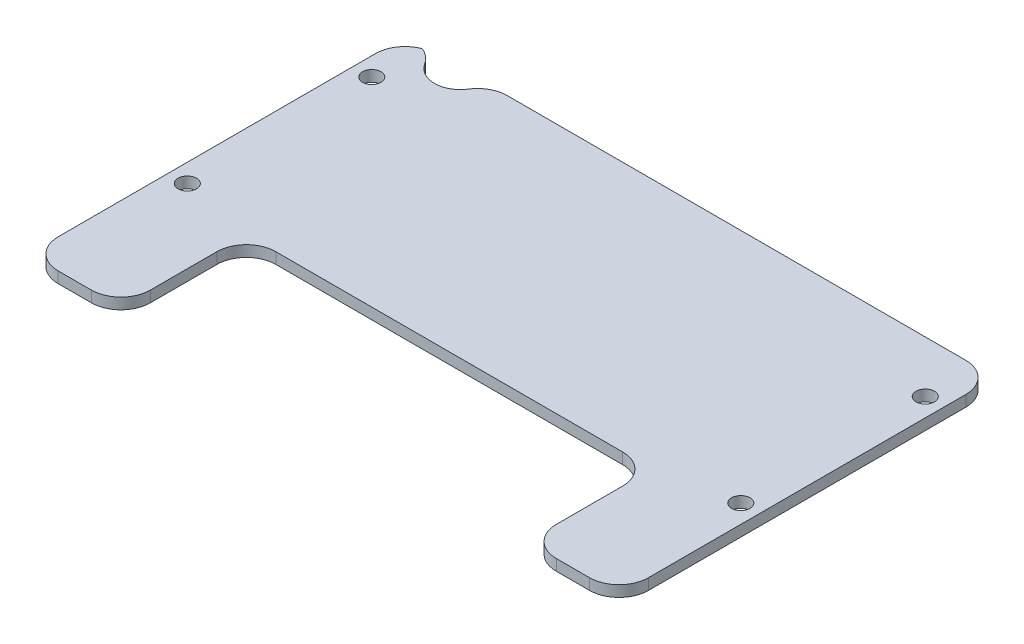
ISO-10303-21;
HEADER;
FILE_DESCRIPTION(('STEP AP214'),'2;1');
FILE_NAME('part.step','',(''),(''),'','','');
FILE_SCHEMA(('AUTOMOTIVE_DESIGN { 1 0 10303 214 1 1 1 1 }'));
ENDSEC;
DATA;
#1=APPLICATION_CONTEXT('core data for automotive mechanical design processes');
#2=APPLICATION_PROTOCOL_DEFINITION('international standard','automotive_design',2000,#1);
#3=PRODUCT_CONTEXT('',#1,'mechanical');
#4=PRODUCT('Part','Part','',(#3));
#5=PRODUCT_RELATED_PRODUCT_CATEGORY('part','',(#4));
#6=PRODUCT_DEFINITION_FORMATION('','',#4);
#7=PRODUCT_DEFINITION_CONTEXT('part definition',#1,'design');
#8=PRODUCT_DEFINITION('design','',#6,#7);
#9=PRODUCT_DEFINITION_SHAPE('','',#8);
#10=(LENGTH_UNIT() NAMED_UNIT(*) SI_UNIT(.MILLI.,.METRE.));
#11=(NAMED_UNIT(*) PLANE_ANGLE_UNIT() SI_UNIT($,.RADIAN.));
#12=(NAMED_UNIT(*) SI_UNIT($,.STERADIAN.) SOLID_ANGLE_UNIT());
#13=UNCERTAINTY_MEASURE_WITH_UNIT(LENGTH_MEASURE(1.E-05),#10,'distance_accuracy_value','');
#14=(GEOMETRIC_REPRESENTATION_CONTEXT(3) GLOBAL_UNCERTAINTY_ASSIGNED_CONTEXT((#13)) GLOBAL_UNIT_ASSIGNED_CONTEXT((#10,
#11,#12)) REPRESENTATION_CONTEXT('',''));
#15=CARTESIAN_POINT('',(0.,0.,0.));
#16=DIRECTION('',(0.,0.,1.));
#17=DIRECTION('',(1.,0.,0.));
#18=AXIS2_PLACEMENT_3D('',#15,#16,#17);
#19=CARTESIAN_POINT('',(-40.,1.5,0.));
#20=DIRECTION('',(0.,0.,1.));
#21=DIRECTION('',(1.,0.,0.));
#22=AXIS2_PLACEMENT_3D('',#19,#20,#21);
#23=PLANE('',#22);
#24=DIRECTION('',(-1.,0.,0.));
#25=VECTOR('',#24,1.);
#26=CARTESIAN_POINT('',(-40.,0.,0.));
#27=LINE('',#26,#25);
#28=CARTESIAN_POINT('',(36.,0.,0.));
#29=VERTEX_POINT('',#28);
#30=CARTESIAN_POINT('',(-26.1557112297752,0.,0.));
#31=VERTEX_POINT('',#30);
#32=EDGE_CURVE('E181',#29,#31,#27,.T.);
#33=ORIENTED_EDGE('',*,*,#32,.T.);
#34=DIRECTION('',(0.,1.,0.));
#35=VECTOR('',#34,1.);
#36=CARTESIAN_POINT('',(-26.1557112297752,1.5,0.));
#37=LINE('',#36,#35);
#38=CARTESIAN_POINT('',(-26.1557112297752,1.5,0.));
#39=VERTEX_POINT('',#38);
#40=EDGE_CURVE('E185',#31,#39,#37,.T.);
#41=ORIENTED_EDGE('',*,*,#40,.T.);
#42=DIRECTION('',(-1.,0.,0.));
#43=VECTOR('',#42,1.);
#44=CARTESIAN_POINT('',(-40.,1.5,0.));
#45=LINE('',#44,#43);
#46=CARTESIAN_POINT('',(36.,1.5,0.));
#47=VERTEX_POINT('',#46);
#48=EDGE_CURVE('E184',#47,#39,#45,.T.);
#49=ORIENTED_EDGE('',*,*,#48,.F.);
#50=DIRECTION('',(0.,-1.,0.));
#51=VECTOR('',#50,1.);
#52=CARTESIAN_POINT('',(36.,1.5,0.));
#53=LINE('',#52,#51);
#54=EDGE_CURVE('E170',#47,#29,#53,.T.);
#55=ORIENTED_EDGE('',*,*,#54,.T.);
#56=EDGE_LOOP('',(#33,#41,#49,#55));
#57=FACE_BOUND('',#56,.T.);
#58=ADVANCED_FACE('F35',(#57),#23,.F.);
#59=CARTESIAN_POINT('',(-40.,1.5,51.));
#60=DIRECTION('',(0.,0.,-1.));
#61=DIRECTION('',(-1.,0.,0.));
#62=AXIS2_PLACEMENT_3D('',#59,#60,#61);
#63=PLANE('',#62);
#64=DIRECTION('',(1.,0.,0.));
#65=VECTOR('',#64,1.);
#66=CARTESIAN_POINT('',(-40.,0.,51.));
#67=LINE('',#66,#65);
#68=CARTESIAN_POINT('',(-36.,0.,51.));
#69=VERTEX_POINT('',#68);
#70=CARTESIAN_POINT('',(-31.5,0.,51.));
#71=VERTEX_POINT('',#70);
#72=EDGE_CURVE('E198',#69,#71,#67,.T.);
#73=ORIENTED_EDGE('',*,*,#72,.T.);
#74=DIRECTION('',(0.,1.,0.));
#75=VECTOR('',#74,1.);
#76=CARTESIAN_POINT('',(-31.5,1.5,51.));
#77=LINE('',#76,#75);
#78=CARTESIAN_POINT('',(-31.5,1.5,51.));
#79=VERTEX_POINT('',#78);
#80=EDGE_CURVE('E264',#71,#79,#77,.T.);
#81=ORIENTED_EDGE('',*,*,#80,.T.);
#82=DIRECTION('',(1.,0.,0.));
#83=VECTOR('',#82,1.);
#84=CARTESIAN_POINT('',(-40.,1.5,51.));
#85=LINE('',#84,#83);
#86=CARTESIAN_POINT('',(-36.,1.5,51.));
#87=VERTEX_POINT('',#86);
#88=EDGE_CURVE('E315',#87,#79,#85,.T.);
#89=ORIENTED_EDGE('',*,*,#88,.F.);
#90=DIRECTION('',(0.,-1.,0.));
#91=VECTOR('',#90,1.);
#92=CARTESIAN_POINT('',(-36.,1.5,51.));
#93=LINE('',#92,#91);
#94=EDGE_CURVE('E261',#87,#69,#93,.T.);
#95=ORIENTED_EDGE('',*,*,#94,.T.);
#96=EDGE_LOOP('',(#73,#81,#89,#95));
#97=FACE_BOUND('',#96,.T.);
#98=ADVANCED_FACE('F349',(#97),#63,.F.);
#99=CARTESIAN_POINT('',(-40.,1.5,51.));
#100=DIRECTION('',(1.,0.,0.));
#101=DIRECTION('',(0.,0.,-1.));
#102=AXIS2_PLACEMENT_3D('',#99,#100,#101);
#103=PLANE('',#102);
#104=DIRECTION('',(0.,0.,1.));
#105=VECTOR('',#104,1.);
#106=CARTESIAN_POINT('',(-40.,1.5,51.));
#107=LINE('',#106,#105);
#108=CARTESIAN_POINT('',(-40.,1.5,4.));
#109=VERTEX_POINT('',#108);
#110=CARTESIAN_POINT('',(-40.,1.5,47.));
#111=VERTEX_POINT('',#110);
#112=EDGE_CURVE('E192',#109,#111,#107,.T.);
#113=ORIENTED_EDGE('',*,*,#112,.F.);
#114=DIRECTION('',(0.,-1.,0.));
#115=VECTOR('',#114,1.);
#116=CARTESIAN_POINT('',(-40.,1.5,4.));
#117=LINE('',#116,#115);
#118=CARTESIAN_POINT('',(-40.,0.,4.));
#119=VERTEX_POINT('',#118);
#120=EDGE_CURVE('E236',#109,#119,#117,.T.);
#121=ORIENTED_EDGE('',*,*,#120,.T.);
#122=DIRECTION('',(0.,0.,1.));
#123=VECTOR('',#122,1.);
#124=CARTESIAN_POINT('',(-40.,0.,51.));
#125=LINE('',#124,#123);
#126=CARTESIAN_POINT('',(-40.,0.,47.));
#127=VERTEX_POINT('',#126);
#128=EDGE_CURVE('E308',#119,#127,#125,.T.);
#129=ORIENTED_EDGE('',*,*,#128,.T.);
#130=DIRECTION('',(0.,-1.,0.));
#131=VECTOR('',#130,1.);
#132=CARTESIAN_POINT('',(-40.,1.5,47.));
#133=LINE('',#132,#131);
#134=EDGE_CURVE('E234',#127,#111,#133,.F.);
#135=ORIENTED_EDGE('',*,*,#134,.T.);
#136=EDGE_LOOP('',(#113,#121,#129,#135));
#137=FACE_BOUND('',#136,.T.);
#138=ADVANCED_FACE('F347',(#137),#103,.F.);
#139=CARTESIAN_POINT('',(31.5,0.,51.));
#140=VERTEX_POINT('',#139);
#141=CARTESIAN_POINT('',(36.,0.,51.));
#142=VERTEX_POINT('',#141);
#143=EDGE_CURVE('E320',#140,#142,#67,.T.);
#144=ORIENTED_EDGE('',*,*,#143,.T.);
#145=DIRECTION('',(0.,-1.,0.));
#146=VECTOR('',#145,1.);
#147=CARTESIAN_POINT('',(36.,1.5,51.));
#148=LINE('',#147,#146);
#149=CARTESIAN_POINT('',(36.,1.5,51.));
#150=VERTEX_POINT('',#149);
#151=EDGE_CURVE('E254',#142,#150,#148,.F.);
#152=ORIENTED_EDGE('',*,*,#151,.T.);
#153=CARTESIAN_POINT('',(31.5,1.5,51.));
#154=VERTEX_POINT('',#153);
#155=EDGE_CURVE('E196',#154,#150,#85,.T.);
#156=ORIENTED_EDGE('',*,*,#155,.F.);
#157=DIRECTION('',(0.,1.,0.));
#158=VECTOR('',#157,1.);
#159=CARTESIAN_POINT('',(31.5,1.5,51.));
#160=LINE('',#159,#158);
#161=EDGE_CURVE('E252',#154,#140,#160,.F.);
#162=ORIENTED_EDGE('',*,*,#161,.T.);
#163=EDGE_LOOP('',(#144,#152,#156,#162));
#164=FACE_BOUND('',#163,.T.);
#165=ADVANCED_FACE('F328',(#164),#63,.F.);
#166=CARTESIAN_POINT('',(40.,1.5,51.));
#167=DIRECTION('',(-1.,0.,0.));
#168=DIRECTION('',(0.,0.,1.));
#169=AXIS2_PLACEMENT_3D('',#166,#167,#168);
#170=PLANE('',#169);
#171=DIRECTION('',(0.,0.,-1.));
#172=VECTOR('',#171,1.);
#173=CARTESIAN_POINT('',(40.,0.,51.));
#174=LINE('',#173,#172);
#175=CARTESIAN_POINT('',(40.,0.,47.));
#176=VERTEX_POINT('',#175);
#177=CARTESIAN_POINT('',(40.,0.,4.));
#178=VERTEX_POINT('',#177);
#179=EDGE_CURVE('E193',#176,#178,#174,.T.);
#180=ORIENTED_EDGE('',*,*,#179,.T.);
#181=DIRECTION('',(0.,-1.,0.));
#182=VECTOR('',#181,1.);
#183=CARTESIAN_POINT('',(40.,1.5,4.));
#184=LINE('',#183,#182);
#185=CARTESIAN_POINT('',(40.,1.5,4.));
#186=VERTEX_POINT('',#185);
#187=EDGE_CURVE('E171',#178,#186,#184,.F.);
#188=ORIENTED_EDGE('',*,*,#187,.T.);
#189=DIRECTION('',(0.,0.,-1.));
#190=VECTOR('',#189,1.);
#191=CARTESIAN_POINT('',(40.,1.5,51.));
#192=LINE('',#191,#190);
#193=CARTESIAN_POINT('',(40.,1.5,47.));
#194=VERTEX_POINT('',#193);
#195=EDGE_CURVE('E316',#194,#186,#192,.T.);
#196=ORIENTED_EDGE('',*,*,#195,.F.);
#197=DIRECTION('',(0.,-1.,0.));
#198=VECTOR('',#197,1.);
#199=CARTESIAN_POINT('',(40.,1.5,47.));
#200=LINE('',#199,#198);
#201=EDGE_CURVE('E248',#194,#176,#200,.T.);
#202=ORIENTED_EDGE('',*,*,#201,.T.);
#203=EDGE_LOOP('',(#180,#188,#196,#202));
#204=FACE_BOUND('',#203,.T.);
#205=ADVANCED_FACE('F338',(#204),#170,.F.);
#206=CARTESIAN_POINT('',(0.,1.5,0.));
#207=DIRECTION('',(0.,-1.,0.));
#208=DIRECTION('',(0.,0.,-1.));
#209=AXIS2_PLACEMENT_3D('',#206,#207,#208);
#210=PLANE('',#209);
#211=CARTESIAN_POINT('',(37.5,1.5,32.));
#212=DIRECTION('',(0.,1.,0.));
#213=DIRECTION('',(0.,0.,-1.));
#214=AXIS2_PLACEMENT_3D('',#211,#212,#213);
#215=CIRCLE('',#214,1.25);
#216=CARTESIAN_POINT('',(37.5,1.5,30.75));
#217=VERTEX_POINT('',#216);
#218=EDGE_CURVE('E399',#217,#217,#215,.T.);
#219=ORIENTED_EDGE('',*,*,#218,.F.);
#220=EDGE_LOOP('',(#219));
#221=FACE_BOUND('',#220,.T.);
#222=CARTESIAN_POINT('',(37.5,1.5,7.00000000000001));
#223=DIRECTION('',(0.,1.,0.));
#224=DIRECTION('',(0.,0.,-1.));
#225=AXIS2_PLACEMENT_3D('',#222,#223,#224);
#226=CIRCLE('',#225,1.25000000000001);
#227=CARTESIAN_POINT('',(37.5,1.5,5.75));
#228=VERTEX_POINT('',#227);
#229=EDGE_CURVE('E401',#228,#228,#226,.T.);
#230=ORIENTED_EDGE('',*,*,#229,.F.);
#231=EDGE_LOOP('',(#230));
#232=FACE_BOUND('',#231,.T.);
#233=CARTESIAN_POINT('',(-37.5,1.5,7.00000000000001));
#234=DIRECTION('',(0.,1.,0.));
#235=DIRECTION('',(0.,0.,1.));
#236=AXIS2_PLACEMENT_3D('',#233,#234,#235);
#237=CIRCLE('',#236,1.25000000000001);
#238=CARTESIAN_POINT('',(-37.5,1.5,8.25000000000001));
#239=VERTEX_POINT('',#238);
#240=EDGE_CURVE('E413',#239,#239,#237,.T.);
#241=ORIENTED_EDGE('',*,*,#240,.F.);
#242=EDGE_LOOP('',(#241));
#243=FACE_BOUND('',#242,.T.);
#244=CARTESIAN_POINT('',(-37.5,1.5,32.));
#245=DIRECTION('',(0.,1.,0.));
#246=DIRECTION('',(0.,0.,1.));
#247=AXIS2_PLACEMENT_3D('',#244,#245,#246);
#248=CIRCLE('',#247,1.25);
#249=CARTESIAN_POINT('',(-37.5,1.5,33.25));
#250=VERTEX_POINT('',#249);
#251=EDGE_CURVE('E304',#250,#250,#248,.T.);
#252=ORIENTED_EDGE('',*,*,#251,.F.);
#253=EDGE_LOOP('',(#252));
#254=FACE_BOUND('',#253,.T.);
#255=ORIENTED_EDGE('',*,*,#48,.T.);
#256=CARTESIAN_POINT('',(-26.1557112297752,1.5,4.));
#257=DIRECTION('',(0.,-1.,0.));
#258=DIRECTION('',(0.,0.,-1.));
#259=AXIS2_PLACEMENT_3D('',#256,#257,#258);
#260=CIRCLE('',#259,4.);
#261=CARTESIAN_POINT('',(-29.5393319072284,1.5,1.86666666666667));
#262=VERTEX_POINT('',#261);
#263=EDGE_CURVE('E217',#39,#262,#260,.F.);
#264=ORIENTED_EDGE('',*,*,#263,.T.);
#265=CARTESIAN_POINT('',(-32.5,1.5,0.));
#266=DIRECTION('',(0.,1.,0.));
#267=DIRECTION('',(0.,0.,1.));
#268=AXIS2_PLACEMENT_3D('',#265,#266,#267);
#269=CIRCLE('',#268,3.5);
#270=CARTESIAN_POINT('',(-35.4606680927716,1.5,1.86666666666667));
#271=VERTEX_POINT('',#270);
#272=EDGE_CURVE('E408',#271,#262,#269,.T.);
#273=ORIENTED_EDGE('',*,*,#272,.F.);
#274=CARTESIAN_POINT('',(-38.8442887702248,1.5,4.));
#275=DIRECTION('',(0.,-1.,0.));
#276=DIRECTION('',(0.,0.,-1.));
#277=AXIS2_PLACEMENT_3D('',#274,#275,#276);
#278=CIRCLE('',#277,4.);
#279=CARTESIAN_POINT('',(-37.4221443851124,1.5,0.261349795996776));
#280=VERTEX_POINT('',#279);
#281=EDGE_CURVE('E215',#271,#280,#278,.F.);
#282=ORIENTED_EDGE('',*,*,#281,.T.);
#283=CARTESIAN_POINT('',(-36.,1.5,4.));
#284=DIRECTION('',(0.,-1.,0.));
#285=DIRECTION('',(0.,0.,-1.));
#286=AXIS2_PLACEMENT_3D('',#283,#284,#285);
#287=CIRCLE('',#286,4.);
#288=EDGE_CURVE('E213',#280,#109,#287,.F.);
#289=ORIENTED_EDGE('',*,*,#288,.T.);
#290=ORIENTED_EDGE('',*,*,#112,.T.);
#291=CARTESIAN_POINT('',(-36.,1.5,47.));
#292=DIRECTION('',(0.,-1.,0.));
#293=DIRECTION('',(0.,0.,-1.));
#294=AXIS2_PLACEMENT_3D('',#291,#292,#293);
#295=CIRCLE('',#294,4.);
#296=EDGE_CURVE('E203',#111,#87,#295,.F.);
#297=ORIENTED_EDGE('',*,*,#296,.T.);
#298=ORIENTED_EDGE('',*,*,#88,.T.);
#299=CARTESIAN_POINT('',(-31.5,1.5,47.));
#300=DIRECTION('',(0.,-1.,0.));
#301=DIRECTION('',(0.,0.,-1.));
#302=AXIS2_PLACEMENT_3D('',#299,#300,#301);
#303=CIRCLE('',#302,4.);
#304=CARTESIAN_POINT('',(-27.5,1.5,47.));
#305=VERTEX_POINT('',#304);
#306=EDGE_CURVE('E205',#79,#305,#303,.F.);
#307=ORIENTED_EDGE('',*,*,#306,.T.);
#308=DIRECTION('',(0.,0.,1.));
#309=VECTOR('',#308,1.);
#310=CARTESIAN_POINT('',(-27.5,1.5,51.));
#311=LINE('',#310,#309);
#312=CARTESIAN_POINT('',(-27.5,1.5,38.));
#313=VERTEX_POINT('',#312);
#314=EDGE_CURVE('E278',#313,#305,#311,.T.);
#315=ORIENTED_EDGE('',*,*,#314,.F.);
#316=CARTESIAN_POINT('',(-23.5,1.5,38.));
#317=DIRECTION('',(0.,-1.,0.));
#318=DIRECTION('',(0.,0.,-1.));
#319=AXIS2_PLACEMENT_3D('',#316,#317,#318);
#320=CIRCLE('',#319,4.);
#321=CARTESIAN_POINT('',(-23.5,1.5,34.));
#322=VERTEX_POINT('',#321);
#323=EDGE_CURVE('E44',#313,#322,#320,.T.);
#324=ORIENTED_EDGE('',*,*,#323,.T.);
#325=DIRECTION('',(-1.,0.,0.));
#326=VECTOR('',#325,1.);
#327=CARTESIAN_POINT('',(-27.5,1.5,34.));
#328=LINE('',#327,#326);
#329=CARTESIAN_POINT('',(23.5,1.5,34.));
#330=VERTEX_POINT('',#329);
#331=EDGE_CURVE('E276',#330,#322,#328,.T.);
#332=ORIENTED_EDGE('',*,*,#331,.F.);
#333=CARTESIAN_POINT('',(23.5,1.5,38.));
#334=DIRECTION('',(0.,-1.,0.));
#335=DIRECTION('',(0.,0.,-1.));
#336=AXIS2_PLACEMENT_3D('',#333,#334,#335);
#337=CIRCLE('',#336,4.);
#338=CARTESIAN_POINT('',(27.5,1.5,38.));
#339=VERTEX_POINT('',#338);
#340=EDGE_CURVE('E267',#330,#339,#337,.T.);
#341=ORIENTED_EDGE('',*,*,#340,.T.);
#342=DIRECTION('',(0.,0.,-1.));
#343=VECTOR('',#342,1.);
#344=CARTESIAN_POINT('',(27.5,1.5,51.));
#345=LINE('',#344,#343);
#346=CARTESIAN_POINT('',(27.5,1.5,47.));
#347=VERTEX_POINT('',#346);
#348=EDGE_CURVE('E288',#347,#339,#345,.T.);
#349=ORIENTED_EDGE('',*,*,#348,.F.);
#350=CARTESIAN_POINT('',(31.5,1.5,47.));
#351=DIRECTION('',(0.,-1.,0.));
#352=DIRECTION('',(0.,0.,-1.));
#353=AXIS2_PLACEMENT_3D('',#350,#351,#352);
#354=CIRCLE('',#353,4.);
#355=EDGE_CURVE('E207',#347,#154,#354,.F.);
#356=ORIENTED_EDGE('',*,*,#355,.T.);
#357=ORIENTED_EDGE('',*,*,#155,.T.);
#358=CARTESIAN_POINT('',(36.,1.5,47.));
#359=DIRECTION('',(0.,-1.,0.));
#360=DIRECTION('',(0.,0.,-1.));
#361=AXIS2_PLACEMENT_3D('',#358,#359,#360);
#362=CIRCLE('',#361,4.);
#363=EDGE_CURVE('E209',#150,#194,#362,.F.);
#364=ORIENTED_EDGE('',*,*,#363,.T.);
#365=ORIENTED_EDGE('',*,*,#195,.T.);
#366=CARTESIAN_POINT('',(36.,1.5,4.));
#367=DIRECTION('',(0.,-1.,0.));
#368=DIRECTION('',(0.,0.,-1.));
#369=AXIS2_PLACEMENT_3D('',#366,#367,#368);
#370=CIRCLE('',#369,4.);
#371=EDGE_CURVE('E211',#186,#47,#370,.F.);
#372=ORIENTED_EDGE('',*,*,#371,.T.);
#373=EDGE_LOOP('',(#255,#264,#273,#282,#289,#290,#297,#298,#307,#315,#324,#332,#341,#349,#356,
#357,#364,#365,#372));
#374=FACE_BOUND('',#373,.T.);
#375=ADVANCED_FACE('F275',(#221,#232,#243,#254,#374),#210,.F.);
#376=CARTESIAN_POINT('',(0.,0.,0.));
#377=DIRECTION('',(0.,-1.,0.));
#378=DIRECTION('',(0.,0.,-1.));
#379=AXIS2_PLACEMENT_3D('',#376,#377,#378);
#380=PLANE('',#379);
#381=CARTESIAN_POINT('',(37.5,0.,32.));
#382=DIRECTION('',(0.,1.,0.));
#383=DIRECTION('',(0.,0.,-1.));
#384=AXIS2_PLACEMENT_3D('',#381,#382,#383);
#385=CIRCLE('',#384,1.25);
#386=CARTESIAN_POINT('',(37.5,0.,30.75));
#387=VERTEX_POINT('',#386);
#388=EDGE_CURVE('E396',#387,#387,#385,.T.);
#389=ORIENTED_EDGE('',*,*,#388,.T.);
#390=EDGE_LOOP('',(#389));
#391=FACE_BOUND('',#390,.T.);
#392=CARTESIAN_POINT('',(37.5,0.,7.00000000000001));
#393=DIRECTION('',(0.,1.,0.));
#394=DIRECTION('',(0.,0.,-1.));
#395=AXIS2_PLACEMENT_3D('',#392,#393,#394);
#396=CIRCLE('',#395,1.25000000000001);
#397=CARTESIAN_POINT('',(37.5,0.,5.75));
#398=VERTEX_POINT('',#397);
#399=EDGE_CURVE('E405',#398,#398,#396,.T.);
#400=ORIENTED_EDGE('',*,*,#399,.T.);
#401=EDGE_LOOP('',(#400));
#402=FACE_BOUND('',#401,.T.);
#403=CARTESIAN_POINT('',(-32.5,0.,0.));
#404=DIRECTION('',(0.,1.,0.));
#405=DIRECTION('',(0.,0.,1.));
#406=AXIS2_PLACEMENT_3D('',#403,#404,#405);
#407=CIRCLE('',#406,3.5);
#408=CARTESIAN_POINT('',(-35.4606680927716,0.,1.86666666666667));
#409=VERTEX_POINT('',#408);
#410=CARTESIAN_POINT('',(-29.5393319072284,0.,1.86666666666667));
#411=VERTEX_POINT('',#410);
#412=EDGE_CURVE('E411',#409,#411,#407,.T.);
#413=ORIENTED_EDGE('',*,*,#412,.T.);
#414=CARTESIAN_POINT('',(-26.1557112297752,0.,4.));
#415=DIRECTION('',(0.,-1.,0.));
#416=DIRECTION('',(0.,0.,-1.));
#417=AXIS2_PLACEMENT_3D('',#414,#415,#416);
#418=CIRCLE('',#417,4.);
#419=EDGE_CURVE('E191',#411,#31,#418,.T.);
#420=ORIENTED_EDGE('',*,*,#419,.T.);
#421=ORIENTED_EDGE('',*,*,#32,.F.);
#422=CARTESIAN_POINT('',(36.,0.,4.));
#423=DIRECTION('',(0.,-1.,0.));
#424=DIRECTION('',(0.,0.,-1.));
#425=AXIS2_PLACEMENT_3D('',#422,#423,#424);
#426=CIRCLE('',#425,4.);
#427=EDGE_CURVE('E166',#29,#178,#426,.T.);
#428=ORIENTED_EDGE('',*,*,#427,.T.);
#429=ORIENTED_EDGE('',*,*,#179,.F.);
#430=CARTESIAN_POINT('',(36.,0.,47.));
#431=DIRECTION('',(0.,-1.,0.));
#432=DIRECTION('',(0.,0.,-1.));
#433=AXIS2_PLACEMENT_3D('',#430,#431,#432);
#434=CIRCLE('',#433,4.);
#435=EDGE_CURVE('E175',#176,#142,#434,.T.);
#436=ORIENTED_EDGE('',*,*,#435,.T.);
#437=ORIENTED_EDGE('',*,*,#143,.F.);
#438=CARTESIAN_POINT('',(31.5,0.,47.));
#439=DIRECTION('',(0.,-1.,0.));
#440=DIRECTION('',(0.,0.,-1.));
#441=AXIS2_PLACEMENT_3D('',#438,#439,#440);
#442=CIRCLE('',#441,4.);
#443=CARTESIAN_POINT('',(27.5,0.,47.));
#444=VERTEX_POINT('',#443);
#445=EDGE_CURVE('E227',#140,#444,#442,.T.);
#446=ORIENTED_EDGE('',*,*,#445,.T.);
#447=DIRECTION('',(0.,0.,-1.));
#448=VECTOR('',#447,1.);
#449=CARTESIAN_POINT('',(27.5,0.,51.));
#450=LINE('',#449,#448);
#451=CARTESIAN_POINT('',(27.5,0.,38.));
#452=VERTEX_POINT('',#451);
#453=EDGE_CURVE('E299',#444,#452,#450,.T.);
#454=ORIENTED_EDGE('',*,*,#453,.T.);
#455=CARTESIAN_POINT('',(23.5,0.,38.));
#456=DIRECTION('',(0.,-1.,0.));
#457=DIRECTION('',(0.,0.,-1.));
#458=AXIS2_PLACEMENT_3D('',#455,#456,#457);
#459=CIRCLE('',#458,4.);
#460=CARTESIAN_POINT('',(23.5,0.,34.));
#461=VERTEX_POINT('',#460);
#462=EDGE_CURVE('E269',#452,#461,#459,.F.);
#463=ORIENTED_EDGE('',*,*,#462,.T.);
#464=DIRECTION('',(-1.,0.,0.));
#465=VECTOR('',#464,1.);
#466=CARTESIAN_POINT('',(-27.5,0.,34.));
#467=LINE('',#466,#465);
#468=CARTESIAN_POINT('',(-23.5,0.,34.));
#469=VERTEX_POINT('',#468);
#470=EDGE_CURVE('E295',#461,#469,#467,.T.);
#471=ORIENTED_EDGE('',*,*,#470,.T.);
#472=CARTESIAN_POINT('',(-23.5,0.,38.));
#473=DIRECTION('',(0.,-1.,0.));
#474=DIRECTION('',(0.,0.,-1.));
#475=AXIS2_PLACEMENT_3D('',#472,#473,#474);
#476=CIRCLE('',#475,4.);
#477=CARTESIAN_POINT('',(-27.5,0.,38.));
#478=VERTEX_POINT('',#477);
#479=EDGE_CURVE('E11',#469,#478,#476,.F.);
#480=ORIENTED_EDGE('',*,*,#479,.T.);
#481=DIRECTION('',(0.,0.,1.));
#482=VECTOR('',#481,1.);
#483=CARTESIAN_POINT('',(-27.5,0.,51.));
#484=LINE('',#483,#482);
#485=CARTESIAN_POINT('',(-27.5,0.,47.));
#486=VERTEX_POINT('',#485);
#487=EDGE_CURVE('E287',#478,#486,#484,.T.);
#488=ORIENTED_EDGE('',*,*,#487,.T.);
#489=CARTESIAN_POINT('',(-31.5,0.,47.));
#490=DIRECTION('',(0.,-1.,0.));
#491=DIRECTION('',(0.,0.,-1.));
#492=AXIS2_PLACEMENT_3D('',#489,#490,#491);
#493=CIRCLE('',#492,4.);
#494=EDGE_CURVE('E225',#486,#71,#493,.T.);
#495=ORIENTED_EDGE('',*,*,#494,.T.);
#496=ORIENTED_EDGE('',*,*,#72,.F.);
#497=CARTESIAN_POINT('',(-36.,0.,47.));
#498=DIRECTION('',(0.,-1.,0.));
#499=DIRECTION('',(0.,0.,-1.));
#500=AXIS2_PLACEMENT_3D('',#497,#498,#499);
#501=CIRCLE('',#500,4.);
#502=EDGE_CURVE('E57',#69,#127,#501,.T.);
#503=ORIENTED_EDGE('',*,*,#502,.T.);
#504=ORIENTED_EDGE('',*,*,#128,.F.);
#505=CARTESIAN_POINT('',(-36.,0.,4.));
#506=DIRECTION('',(0.,-1.,0.));
#507=DIRECTION('',(0.,0.,-1.));
#508=AXIS2_PLACEMENT_3D('',#505,#506,#507);
#509=CIRCLE('',#508,4.);
#510=CARTESIAN_POINT('',(-37.4221443851124,0.,0.261349795996776));
#511=VERTEX_POINT('',#510);
#512=EDGE_CURVE('E51',#119,#511,#509,.T.);
#513=ORIENTED_EDGE('',*,*,#512,.T.);
#514=CARTESIAN_POINT('',(-38.8442887702248,0.,4.));
#515=DIRECTION('',(0.,-1.,0.));
#516=DIRECTION('',(0.,0.,-1.));
#517=AXIS2_PLACEMENT_3D('',#514,#515,#516);
#518=CIRCLE('',#517,4.);
#519=EDGE_CURVE('E231',#511,#409,#518,.T.);
#520=ORIENTED_EDGE('',*,*,#519,.T.);
#521=EDGE_LOOP('',(#413,#420,#421,#428,#429,#436,#437,#446,#454,#463,#471,#480,#488,#495,#496,
#503,#504,#513,#520));
#522=FACE_BOUND('',#521,.T.);
#523=CARTESIAN_POINT('',(-37.5,0.,7.00000000000001));
#524=DIRECTION('',(0.,1.,0.));
#525=DIRECTION('',(0.,0.,1.));
#526=AXIS2_PLACEMENT_3D('',#523,#524,#525);
#527=CIRCLE('',#526,1.25000000000001);
#528=CARTESIAN_POINT('',(-37.5,0.,8.25000000000001));
#529=VERTEX_POINT('',#528);
#530=EDGE_CURVE('E416',#529,#529,#527,.T.);
#531=ORIENTED_EDGE('',*,*,#530,.T.);
#532=EDGE_LOOP('',(#531));
#533=FACE_BOUND('',#532,.T.);
#534=CARTESIAN_POINT('',(-37.5,0.,32.));
#535=DIRECTION('',(0.,1.,0.));
#536=DIRECTION('',(0.,0.,1.));
#537=AXIS2_PLACEMENT_3D('',#534,#535,#536);
#538=CIRCLE('',#537,1.25);
#539=CARTESIAN_POINT('',(-37.5,0.,33.25));
#540=VERTEX_POINT('',#539);
#541=EDGE_CURVE('E310',#540,#540,#538,.T.);
#542=ORIENTED_EDGE('',*,*,#541,.T.);
#543=EDGE_LOOP('',(#542));
#544=FACE_BOUND('',#543,.T.);
#545=ADVANCED_FACE('F188',(#391,#402,#522,#533,#544),#380,.T.);
#546=CARTESIAN_POINT('',(-27.5,0.,51.));
#547=DIRECTION('',(-1.,0.,0.));
#548=DIRECTION('',(0.,0.,1.));
#549=AXIS2_PLACEMENT_3D('',#546,#547,#548);
#550=PLANE('',#549);
#551=ORIENTED_EDGE('',*,*,#487,.F.);
#552=DIRECTION('',(0.,1.,0.));
#553=VECTOR('',#552,1.);
#554=CARTESIAN_POINT('',(-27.5,1.5,38.));
#555=LINE('',#554,#553);
#556=EDGE_CURVE('E258',#478,#313,#555,.T.);
#557=ORIENTED_EDGE('',*,*,#556,.T.);
#558=ORIENTED_EDGE('',*,*,#314,.T.);
#559=DIRECTION('',(0.,1.,0.));
#560=VECTOR('',#559,1.);
#561=CARTESIAN_POINT('',(-27.5,0.,47.));
#562=LINE('',#561,#560);
#563=EDGE_CURVE('E256',#305,#486,#562,.F.);
#564=ORIENTED_EDGE('',*,*,#563,.T.);
#565=EDGE_LOOP('',(#551,#557,#558,#564));
#566=FACE_BOUND('',#565,.T.);
#567=ADVANCED_FACE('F297',(#566),#550,.F.);
#568=CARTESIAN_POINT('',(-27.5,0.,34.));
#569=DIRECTION('',(0.,0.,-1.));
#570=DIRECTION('',(-1.,0.,0.));
#571=AXIS2_PLACEMENT_3D('',#568,#569,#570);
#572=PLANE('',#571);
#573=ORIENTED_EDGE('',*,*,#470,.F.);
#574=DIRECTION('',(0.,1.,0.));
#575=VECTOR('',#574,1.);
#576=CARTESIAN_POINT('',(23.5,1.5,34.));
#577=LINE('',#576,#575);
#578=EDGE_CURVE('E240',#461,#330,#577,.T.);
#579=ORIENTED_EDGE('',*,*,#578,.T.);
#580=ORIENTED_EDGE('',*,*,#331,.T.);
#581=DIRECTION('',(0.,1.,0.));
#582=VECTOR('',#581,1.);
#583=CARTESIAN_POINT('',(-23.5,0.,34.));
#584=LINE('',#583,#582);
#585=EDGE_CURVE('E238',#322,#469,#584,.F.);
#586=ORIENTED_EDGE('',*,*,#585,.T.);
#587=EDGE_LOOP('',(#573,#579,#580,#586));
#588=FACE_BOUND('',#587,.T.);
#589=ADVANCED_FACE('F284',(#588),#572,.F.);
#590=CARTESIAN_POINT('',(27.5,0.,51.));
#591=DIRECTION('',(1.,0.,0.));
#592=DIRECTION('',(0.,0.,-1.));
#593=AXIS2_PLACEMENT_3D('',#590,#591,#592);
#594=PLANE('',#593);
#595=ORIENTED_EDGE('',*,*,#348,.T.);
#596=DIRECTION('',(0.,1.,0.));
#597=VECTOR('',#596,1.);
#598=CARTESIAN_POINT('',(27.5,0.,38.));
#599=LINE('',#598,#597);
#600=EDGE_CURVE('E246',#339,#452,#599,.F.);
#601=ORIENTED_EDGE('',*,*,#600,.T.);
#602=ORIENTED_EDGE('',*,*,#453,.F.);
#603=DIRECTION('',(0.,1.,0.));
#604=VECTOR('',#603,1.);
#605=CARTESIAN_POINT('',(27.5,0.,47.));
#606=LINE('',#605,#604);
#607=EDGE_CURVE('E243',#444,#347,#606,.T.);
#608=ORIENTED_EDGE('',*,*,#607,.T.);
#609=EDGE_LOOP('',(#595,#601,#602,#608));
#610=FACE_BOUND('',#609,.T.);
#611=ADVANCED_FACE('F361',(#610),#594,.F.);
#612=CARTESIAN_POINT('',(-37.5,0.,32.));
#613=DIRECTION('',(0.,1.,0.));
#614=DIRECTION('',(0.,0.,1.));
#615=AXIS2_PLACEMENT_3D('',#612,#613,#614);
#616=CYLINDRICAL_SURFACE('',#615,1.25);
#617=ORIENTED_EDGE('',*,*,#541,.F.);
#618=EDGE_LOOP('',(#617));
#619=FACE_BOUND('',#618,.T.);
#620=ORIENTED_EDGE('',*,*,#251,.T.);
#621=EDGE_LOOP('',(#620));
#622=FACE_BOUND('',#621,.T.);
#623=ADVANCED_FACE('F364',(#619,#622),#616,.F.);
#624=CARTESIAN_POINT('',(-37.5,0.,7.00000000000001));
#625=DIRECTION('',(0.,1.,0.));
#626=DIRECTION('',(0.,0.,1.));
#627=AXIS2_PLACEMENT_3D('',#624,#625,#626);
#628=CYLINDRICAL_SURFACE('',#627,1.25000000000001);
#629=ORIENTED_EDGE('',*,*,#530,.F.);
#630=EDGE_LOOP('',(#629));
#631=FACE_BOUND('',#630,.T.);
#632=ORIENTED_EDGE('',*,*,#240,.T.);
#633=EDGE_LOOP('',(#632));
#634=FACE_BOUND('',#633,.T.);
#635=ADVANCED_FACE('F370',(#631,#634),#628,.F.);
#636=CARTESIAN_POINT('',(-32.5,0.,0.));
#637=DIRECTION('',(0.,1.,0.));
#638=DIRECTION('',(0.,0.,1.));
#639=AXIS2_PLACEMENT_3D('',#636,#637,#638);
#640=CYLINDRICAL_SURFACE('',#639,3.5);
#641=ORIENTED_EDGE('',*,*,#272,.T.);
#642=DIRECTION('',(0.,1.,0.));
#643=VECTOR('',#642,1.);
#644=CARTESIAN_POINT('',(-29.5393319072284,0.,1.86666666666667));
#645=LINE('',#644,#643);
#646=EDGE_CURVE('E222',#262,#411,#645,.F.);
#647=ORIENTED_EDGE('',*,*,#646,.T.);
#648=ORIENTED_EDGE('',*,*,#412,.F.);
#649=DIRECTION('',(0.,1.,0.));
#650=VECTOR('',#649,1.);
#651=CARTESIAN_POINT('',(-35.4606680927716,0.,1.86666666666667));
#652=LINE('',#651,#650);
#653=EDGE_CURVE('E219',#409,#271,#652,.T.);
#654=ORIENTED_EDGE('',*,*,#653,.T.);
#655=EDGE_LOOP('',(#641,#647,#648,#654));
#656=FACE_BOUND('',#655,.T.);
#657=ADVANCED_FACE('F374',(#656),#640,.F.);
#658=CARTESIAN_POINT('',(37.5,0.,7.00000000000001));
#659=DIRECTION('',(0.,1.,0.));
#660=DIRECTION('',(0.,0.,1.));
#661=AXIS2_PLACEMENT_3D('',#658,#659,#660);
#662=CYLINDRICAL_SURFACE('',#661,1.25000000000001);
#663=ORIENTED_EDGE('',*,*,#399,.F.);
#664=EDGE_LOOP('',(#663));
#665=FACE_BOUND('',#664,.T.);
#666=ORIENTED_EDGE('',*,*,#229,.T.);
#667=EDGE_LOOP('',(#666));
#668=FACE_BOUND('',#667,.T.);
#669=ADVANCED_FACE('F378',(#665,#668),#662,.F.);
#670=CARTESIAN_POINT('',(37.5,0.,32.));
#671=DIRECTION('',(0.,1.,0.));
#672=DIRECTION('',(0.,0.,1.));
#673=AXIS2_PLACEMENT_3D('',#670,#671,#672);
#674=CYLINDRICAL_SURFACE('',#673,1.25);
#675=ORIENTED_EDGE('',*,*,#388,.F.);
#676=EDGE_LOOP('',(#675));
#677=FACE_BOUND('',#676,.T.);
#678=ORIENTED_EDGE('',*,*,#218,.T.);
#679=EDGE_LOOP('',(#678));
#680=FACE_BOUND('',#679,.T.);
#681=ADVANCED_FACE('F382',(#677,#680),#674,.F.);
#682=CARTESIAN_POINT('',(-26.1557112297752,0.,4.));
#683=DIRECTION('',(0.,1.,0.));
#684=DIRECTION('',(0.,0.,1.));
#685=AXIS2_PLACEMENT_3D('',#682,#683,#684);
#686=CYLINDRICAL_SURFACE('',#685,4.);
#687=ORIENTED_EDGE('',*,*,#419,.F.);
#688=ORIENTED_EDGE('',*,*,#646,.F.);
#689=ORIENTED_EDGE('',*,*,#263,.F.);
#690=ORIENTED_EDGE('',*,*,#40,.F.);
#691=EDGE_LOOP('',(#687,#688,#689,#690));
#692=FACE_BOUND('',#691,.T.);
#693=ADVANCED_FACE('F385',(#692),#686,.T.);
#694=CARTESIAN_POINT('',(-36.,1.5,4.));
#695=DIRECTION('',(0.,-1.,0.));
#696=DIRECTION('',(0.,0.,-1.));
#697=AXIS2_PLACEMENT_3D('',#694,#695,#696);
#698=CYLINDRICAL_SURFACE('',#697,4.);
#699=DIRECTION('',(0.,-1.,0.));
#700=VECTOR('',#699,1.);
#701=CARTESIAN_POINT('',(-37.4221443851124,0.75,0.261349795996777));
#702=LINE('',#701,#700);
#703=EDGE_CURVE('E39',#511,#280,#702,.F.);
#704=ORIENTED_EDGE('',*,*,#703,.F.);
#705=ORIENTED_EDGE('',*,*,#512,.F.);
#706=ORIENTED_EDGE('',*,*,#120,.F.);
#707=ORIENTED_EDGE('',*,*,#288,.F.);
#708=EDGE_LOOP('',(#704,#705,#706,#707));
#709=FACE_BOUND('',#708,.T.);
#710=ADVANCED_FACE('F390',(#709),#698,.T.);
#711=CARTESIAN_POINT('',(-38.8442887702248,0.,4.));
#712=DIRECTION('',(0.,1.,0.));
#713=DIRECTION('',(0.,0.,1.));
#714=AXIS2_PLACEMENT_3D('',#711,#712,#713);
#715=CYLINDRICAL_SURFACE('',#714,4.);
#716=ORIENTED_EDGE('',*,*,#519,.F.);
#717=ORIENTED_EDGE('',*,*,#703,.T.);
#718=ORIENTED_EDGE('',*,*,#281,.F.);
#719=ORIENTED_EDGE('',*,*,#653,.F.);
#720=EDGE_LOOP('',(#716,#717,#718,#719));
#721=FACE_BOUND('',#720,.T.);
#722=ADVANCED_FACE('F441',(#721),#715,.T.);
#723=CARTESIAN_POINT('',(23.5,0.,38.));
#724=DIRECTION('',(0.,-1.,0.));
#725=DIRECTION('',(0.,0.,-1.));
#726=AXIS2_PLACEMENT_3D('',#723,#724,#725);
#727=CYLINDRICAL_SURFACE('',#726,4.);
#728=ORIENTED_EDGE('',*,*,#462,.F.);
#729=ORIENTED_EDGE('',*,*,#600,.F.);
#730=ORIENTED_EDGE('',*,*,#340,.F.);
#731=ORIENTED_EDGE('',*,*,#578,.F.);
#732=EDGE_LOOP('',(#728,#729,#730,#731));
#733=FACE_BOUND('',#732,.T.);
#734=ADVANCED_FACE('F443',(#733),#727,.F.);
#735=CARTESIAN_POINT('',(36.,1.5,4.));
#736=DIRECTION('',(0.,-1.,0.));
#737=DIRECTION('',(0.,0.,-1.));
#738=AXIS2_PLACEMENT_3D('',#735,#736,#737);
#739=CYLINDRICAL_SURFACE('',#738,4.);
#740=ORIENTED_EDGE('',*,*,#371,.F.);
#741=ORIENTED_EDGE('',*,*,#187,.F.);
#742=ORIENTED_EDGE('',*,*,#427,.F.);
#743=ORIENTED_EDGE('',*,*,#54,.F.);
#744=EDGE_LOOP('',(#740,#741,#742,#743));
#745=FACE_BOUND('',#744,.T.);
#746=ADVANCED_FACE('F169',(#745),#739,.T.);
#747=CARTESIAN_POINT('',(36.,1.5,47.));
#748=DIRECTION('',(0.,-1.,0.));
#749=DIRECTION('',(0.,0.,-1.));
#750=AXIS2_PLACEMENT_3D('',#747,#748,#749);
#751=CYLINDRICAL_SURFACE('',#750,4.);
#752=ORIENTED_EDGE('',*,*,#363,.F.);
#753=ORIENTED_EDGE('',*,*,#151,.F.);
#754=ORIENTED_EDGE('',*,*,#435,.F.);
#755=ORIENTED_EDGE('',*,*,#201,.F.);
#756=EDGE_LOOP('',(#752,#753,#754,#755));
#757=FACE_BOUND('',#756,.T.);
#758=ADVANCED_FACE('F334',(#757),#751,.T.);
#759=CARTESIAN_POINT('',(31.5,0.,47.));
#760=DIRECTION('',(0.,1.,0.));
#761=DIRECTION('',(0.,0.,1.));
#762=AXIS2_PLACEMENT_3D('',#759,#760,#761);
#763=CYLINDRICAL_SURFACE('',#762,4.);
#764=ORIENTED_EDGE('',*,*,#445,.F.);
#765=ORIENTED_EDGE('',*,*,#161,.F.);
#766=ORIENTED_EDGE('',*,*,#355,.F.);
#767=ORIENTED_EDGE('',*,*,#607,.F.);
#768=EDGE_LOOP('',(#764,#765,#766,#767));
#769=FACE_BOUND('',#768,.T.);
#770=ADVANCED_FACE('F458',(#769),#763,.T.);
#771=CARTESIAN_POINT('',(-23.5,0.,38.));
#772=DIRECTION('',(0.,-1.,0.));
#773=DIRECTION('',(0.,0.,-1.));
#774=AXIS2_PLACEMENT_3D('',#771,#772,#773);
#775=CYLINDRICAL_SURFACE('',#774,4.);
#776=ORIENTED_EDGE('',*,*,#479,.F.);
#777=ORIENTED_EDGE('',*,*,#585,.F.);
#778=ORIENTED_EDGE('',*,*,#323,.F.);
#779=ORIENTED_EDGE('',*,*,#556,.F.);
#780=EDGE_LOOP('',(#776,#777,#778,#779));
#781=FACE_BOUND('',#780,.T.);
#782=ADVANCED_FACE('F291',(#781),#775,.F.);
#783=CARTESIAN_POINT('',(-31.5,1.5,47.));
#784=DIRECTION('',(0.,1.,0.));
#785=DIRECTION('',(0.,0.,1.));
#786=AXIS2_PLACEMENT_3D('',#783,#784,#785);
#787=CYLINDRICAL_SURFACE('',#786,4.);
#788=ORIENTED_EDGE('',*,*,#494,.F.);
#789=ORIENTED_EDGE('',*,*,#563,.F.);
#790=ORIENTED_EDGE('',*,*,#306,.F.);
#791=ORIENTED_EDGE('',*,*,#80,.F.);
#792=EDGE_LOOP('',(#788,#789,#790,#791));
#793=FACE_BOUND('',#792,.T.);
#794=ADVANCED_FACE('F463',(#793),#787,.T.);
#795=CARTESIAN_POINT('',(-36.,1.5,47.));
#796=DIRECTION('',(0.,-1.,0.));
#797=DIRECTION('',(0.,0.,-1.));
#798=AXIS2_PLACEMENT_3D('',#795,#796,#797);
#799=CYLINDRICAL_SURFACE('',#798,4.);
#800=ORIENTED_EDGE('',*,*,#296,.F.);
#801=ORIENTED_EDGE('',*,*,#134,.F.);
#802=ORIENTED_EDGE('',*,*,#502,.F.);
#803=ORIENTED_EDGE('',*,*,#94,.F.);
#804=EDGE_LOOP('',(#800,#801,#802,#803));
#805=FACE_BOUND('',#804,.T.);
#806=ADVANCED_FACE('F37',(#805),#799,.T.);
#807=CLOSED_SHELL('',(#58,#98,#138,#165,#205,#375,#545,#567,#589,#611,#623,#635,#657,#669,#681,
#693,#710,#722,#734,#746,#758,#770,#782,#794,#806));
#808=MANIFOLD_SOLID_BREP('B2',#807);
#809=ADVANCED_BREP_SHAPE_REPRESENTATION('',(#18,#808),#14);
#810=SHAPE_DEFINITION_REPRESENTATION(#9,#809);
ENDSEC;
END-ISO-10303-21;
